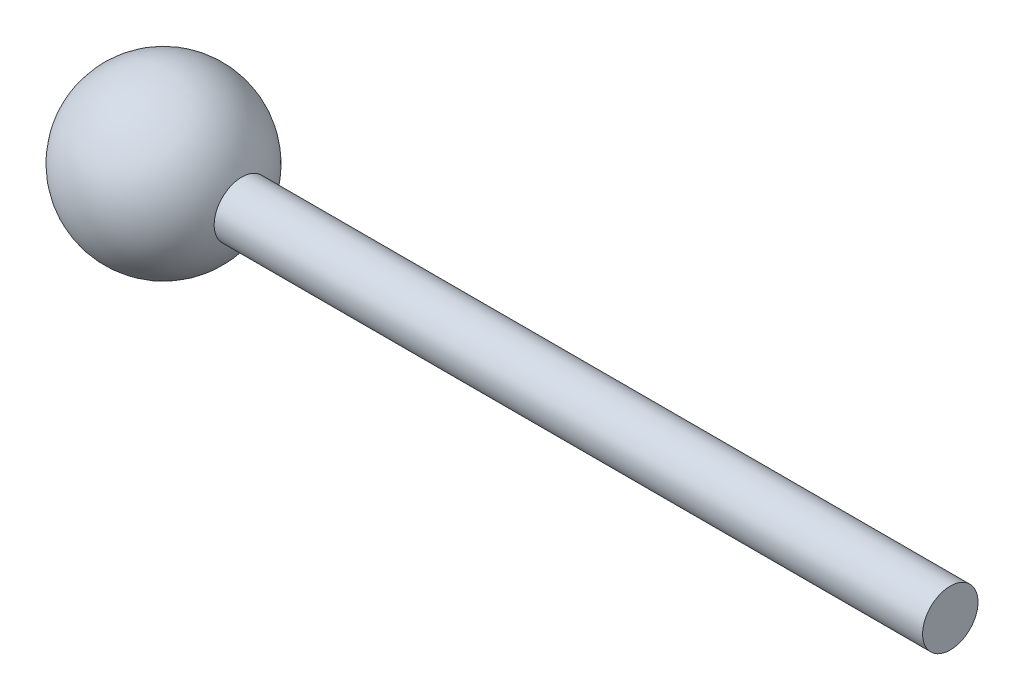
ISO-10303-21;
HEADER;
FILE_DESCRIPTION(('STEP AP214'),'2;1');
FILE_NAME('part.step','',(''),(''),'','','');
FILE_SCHEMA(('AUTOMOTIVE_DESIGN { 1 0 10303 214 1 1 1 1 }'));
ENDSEC;
DATA;
#1=APPLICATION_CONTEXT('core data for automotive mechanical design processes');
#2=APPLICATION_PROTOCOL_DEFINITION('international standard','automotive_design',2000,#1);
#3=PRODUCT_CONTEXT('',#1,'mechanical');
#4=PRODUCT('Part','Part','',(#3));
#5=PRODUCT_RELATED_PRODUCT_CATEGORY('part','',(#4));
#6=PRODUCT_DEFINITION_FORMATION('','',#4);
#7=PRODUCT_DEFINITION_CONTEXT('part definition',#1,'design');
#8=PRODUCT_DEFINITION('design','',#6,#7);
#9=PRODUCT_DEFINITION_SHAPE('','',#8);
#10=(LENGTH_UNIT() NAMED_UNIT(*) SI_UNIT(.MILLI.,.METRE.));
#11=(NAMED_UNIT(*) PLANE_ANGLE_UNIT() SI_UNIT($,.RADIAN.));
#12=(NAMED_UNIT(*) SI_UNIT($,.STERADIAN.) SOLID_ANGLE_UNIT());
#13=UNCERTAINTY_MEASURE_WITH_UNIT(LENGTH_MEASURE(1.E-05),#10,'distance_accuracy_value','');
#14=(GEOMETRIC_REPRESENTATION_CONTEXT(3) GLOBAL_UNCERTAINTY_ASSIGNED_CONTEXT((#13)) GLOBAL_UNIT_ASSIGNED_CONTEXT((#10,
#11,#12)) REPRESENTATION_CONTEXT('',''));
#15=CARTESIAN_POINT('',(0.,0.,0.));
#16=DIRECTION('',(0.,0.,1.));
#17=DIRECTION('',(1.,0.,0.));
#18=AXIS2_PLACEMENT_3D('',#15,#16,#17);
#19=CARTESIAN_POINT('',(0.,0.,0.));
#20=DIRECTION('',(-1.,0.,0.));
#21=DIRECTION('',(0.,1.,0.));
#22=AXIS2_PLACEMENT_3D('',#19,#20,#21);
#23=SPHERICAL_SURFACE('',#22,19.05);
#24=CARTESIAN_POINT('',(17.9605122421383,0.,0.));
#25=DIRECTION('',(-1.,0.,0.));
#26=DIRECTION('',(0.,0.,1.));
#27=AXIS2_PLACEMENT_3D('',#24,#25,#26);
#28=CIRCLE('',#27,6.35);
#29=CARTESIAN_POINT('',(17.9605122421383,0.,6.35));
#30=VERTEX_POINT('',#29);
#31=EDGE_CURVE('E10',#30,#30,#28,.F.);
#32=ORIENTED_EDGE('',*,*,#31,.F.);
#33=EDGE_LOOP('',(#32));
#34=FACE_BOUND('',#33,.T.);
#35=ADVANCED_FACE('F35',(#34),#23,.T.);
#36=CARTESIAN_POINT('',(180.34,0.,0.));
#37=DIRECTION('',(-1.,0.,0.));
#38=DIRECTION('',(0.,0.,1.));
#39=AXIS2_PLACEMENT_3D('',#36,#37,#38);
#40=CYLINDRICAL_SURFACE('',#39,6.35);
#41=CARTESIAN_POINT('',(180.34,0.,0.));
#42=DIRECTION('',(1.,0.,0.));
#43=DIRECTION('',(0.,0.,-1.));
#44=AXIS2_PLACEMENT_3D('',#41,#42,#43);
#45=CIRCLE('',#44,6.35);
#46=CARTESIAN_POINT('',(180.34,0.,-6.35));
#47=VERTEX_POINT('',#46);
#48=EDGE_CURVE('E41',#47,#47,#45,.T.);
#49=ORIENTED_EDGE('',*,*,#48,.F.);
#50=EDGE_LOOP('',(#49));
#51=FACE_BOUND('',#50,.T.);
#52=ORIENTED_EDGE('',*,*,#31,.T.);
#53=EDGE_LOOP('',(#52));
#54=FACE_BOUND('',#53,.T.);
#55=ADVANCED_FACE('F49',(#51,#54),#40,.T.);
#56=CARTESIAN_POINT('',(180.34,0.,0.));
#57=DIRECTION('',(1.,0.,0.));
#58=DIRECTION('',(0.,0.,-1.));
#59=AXIS2_PLACEMENT_3D('',#56,#57,#58);
#60=PLANE('',#59);
#61=ORIENTED_EDGE('',*,*,#48,.T.);
#62=EDGE_LOOP('',(#61));
#63=FACE_BOUND('',#62,.T.);
#64=ADVANCED_FACE('F47',(#63),#60,.T.);
#65=CLOSED_SHELL('',(#35,#55,#64));
#66=MANIFOLD_SOLID_BREP('B2',#65);
#67=ADVANCED_BREP_SHAPE_REPRESENTATION('',(#18,#66),#14);
#68=SHAPE_DEFINITION_REPRESENTATION(#9,#67);
ENDSEC;
END-ISO-10303-21;
